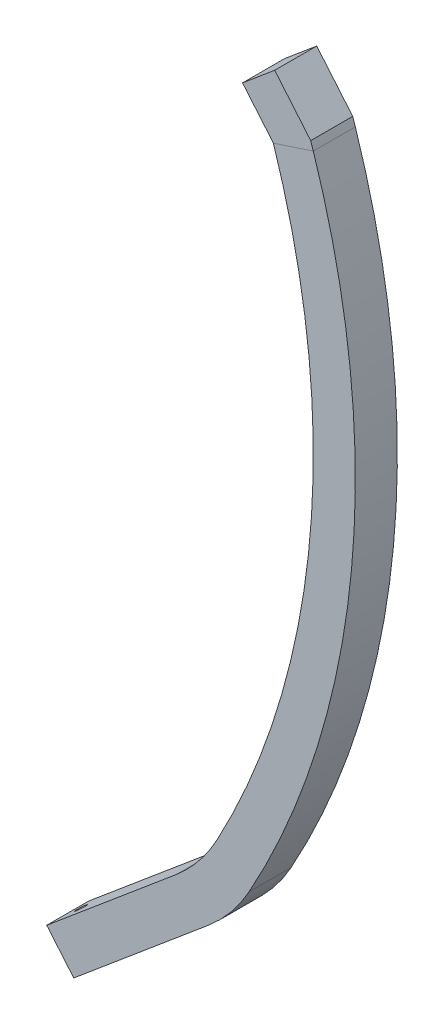
ISO-10303-21;
HEADER;
FILE_DESCRIPTION(('STEP AP214'),'2;1');
FILE_NAME('part.step','',(''),(''),'','','');
FILE_SCHEMA(('AUTOMOTIVE_DESIGN { 1 0 10303 214 1 1 1 1 }'));
ENDSEC;
DATA;
#1=APPLICATION_CONTEXT('core data for automotive mechanical design processes');
#2=APPLICATION_PROTOCOL_DEFINITION('international standard','automotive_design',2000,#1);
#3=PRODUCT_CONTEXT('',#1,'mechanical');
#4=PRODUCT('Part','Part','',(#3));
#5=PRODUCT_RELATED_PRODUCT_CATEGORY('part','',(#4));
#6=PRODUCT_DEFINITION_FORMATION('','',#4);
#7=PRODUCT_DEFINITION_CONTEXT('part definition',#1,'design');
#8=PRODUCT_DEFINITION('design','',#6,#7);
#9=PRODUCT_DEFINITION_SHAPE('','',#8);
#10=(LENGTH_UNIT() NAMED_UNIT(*) SI_UNIT(.MILLI.,.METRE.));
#11=(NAMED_UNIT(*) PLANE_ANGLE_UNIT() SI_UNIT($,.RADIAN.));
#12=(NAMED_UNIT(*) SI_UNIT($,.STERADIAN.) SOLID_ANGLE_UNIT());
#13=UNCERTAINTY_MEASURE_WITH_UNIT(LENGTH_MEASURE(1.E-05),#10,'distance_accuracy_value','');
#14=(GEOMETRIC_REPRESENTATION_CONTEXT(3) GLOBAL_UNCERTAINTY_ASSIGNED_CONTEXT((#13)) GLOBAL_UNIT_ASSIGNED_CONTEXT((#10,
#11,#12)) REPRESENTATION_CONTEXT('',''));
#15=CARTESIAN_POINT('',(0.,0.,0.));
#16=DIRECTION('',(0.,0.,1.));
#17=DIRECTION('',(1.,0.,0.));
#18=AXIS2_PLACEMENT_3D('',#15,#16,#17);
#19=CARTESIAN_POINT('',(15.6848822423879,86.3493613128839,62.996629270052));
#20=DIRECTION('',(-0.311318234282315,0.950305717652662,0.));
#21=DIRECTION('',(-0.950305717652662,-0.311318234282315,0.));
#22=AXIS2_PLACEMENT_3D('',#19,#20,#21);
#23=PLANE('',#22);
#24=DIRECTION('',(0.950305717652662,0.311318234282315,0.));
#25=VECTOR('',#24,1.);
#26=CARTESIAN_POINT('',(15.6848822423879,86.3493613128839,50.9966292700521));
#27=LINE('',#26,#25);
#28=CARTESIAN_POINT('',(15.6848822423879,86.3493613128839,50.9966292700521));
#29=VERTEX_POINT('',#28);
#30=CARTESIAN_POINT('',(27.0885508542199,90.0851801242715,50.9966292700521));
#31=VERTEX_POINT('',#30);
#32=EDGE_CURVE('E118',#29,#31,#27,.T.);
#33=ORIENTED_EDGE('',*,*,#32,.T.);
#34=DIRECTION('',(0.,0.,-1.));
#35=VECTOR('',#34,1.);
#36=CARTESIAN_POINT('',(27.0885508542199,90.0851801242715,62.9966292700521));
#37=LINE('',#36,#35);
#38=CARTESIAN_POINT('',(27.0885508542199,90.0851801242715,62.9966292700521));
#39=VERTEX_POINT('',#38);
#40=EDGE_CURVE('E12',#39,#31,#37,.T.);
#41=ORIENTED_EDGE('',*,*,#40,.F.);
#42=DIRECTION('',(0.950305717652662,0.311318234282315,0.));
#43=VECTOR('',#42,1.);
#44=CARTESIAN_POINT('',(15.6848822423879,86.3493613128839,62.996629270052));
#45=LINE('',#44,#43);
#46=CARTESIAN_POINT('',(15.6848822423879,86.3493613128839,62.996629270052));
#47=VERTEX_POINT('',#46);
#48=EDGE_CURVE('E126',#47,#39,#45,.T.);
#49=ORIENTED_EDGE('',*,*,#48,.F.);
#50=DIRECTION('',(0.,0.,-1.));
#51=VECTOR('',#50,1.);
#52=CARTESIAN_POINT('',(15.6848822423879,86.3493613128839,62.996629270052));
#53=LINE('',#52,#51);
#54=EDGE_CURVE('E114',#47,#29,#53,.T.);
#55=ORIENTED_EDGE('',*,*,#54,.T.);
#56=EDGE_LOOP('',(#33,#41,#49,#55));
#57=FACE_BOUND('',#56,.T.);
#58=ADVANCED_FACE('F44',(#57),#23,.F.);
#59=CARTESIAN_POINT('',(-202.387921552125,14.9091511140061,62.9966292700511));
#60=DIRECTION('',(0.,0.,-1.));
#61=DIRECTION('',(0.,-1.,0.));
#62=AXIS2_PLACEMENT_3D('',#59,#60,#61);
#63=CYLINDRICAL_SURFACE('',#62,241.476472406345);
#64=CARTESIAN_POINT('',(-202.387921552125,14.9091511140062,50.996629270051));
#65=DIRECTION('',(0.,0.,1.));
#66=DIRECTION('',(0.,1.,0.));
#67=AXIS2_PLACEMENT_3D('',#64,#65,#66);
#68=CIRCLE('',#67,241.476472406345);
#69=CARTESIAN_POINT('',(26.3474014816234,92.3109516257451,50.9966292700521));
#70=VERTEX_POINT('',#69);
#71=EDGE_CURVE('E121',#31,#70,#68,.T.);
#72=ORIENTED_EDGE('',*,*,#71,.T.);
#73=DIRECTION('',(0.,0.,-1.));
#74=VECTOR('',#73,1.);
#75=CARTESIAN_POINT('',(26.3474014816233,92.3109516257451,62.9966292700521));
#76=LINE('',#75,#74);
#77=CARTESIAN_POINT('',(26.3474014816233,92.3109516257451,62.9966292700521));
#78=VERTEX_POINT('',#77);
#79=EDGE_CURVE('E52',#78,#70,#76,.T.);
#80=ORIENTED_EDGE('',*,*,#79,.F.);
#81=CARTESIAN_POINT('',(-202.387921552125,14.9091511140061,62.9966292700511));
#82=DIRECTION('',(0.,0.,1.));
#83=DIRECTION('',(0.,1.,0.));
#84=AXIS2_PLACEMENT_3D('',#81,#82,#83);
#85=CIRCLE('',#84,241.476472406345);
#86=EDGE_CURVE('E94',#39,#78,#85,.T.);
#87=ORIENTED_EDGE('',*,*,#86,.F.);
#88=ORIENTED_EDGE('',*,*,#40,.T.);
#89=EDGE_LOOP('',(#72,#80,#87,#88));
#90=FACE_BOUND('',#89,.T.);
#91=ADVANCED_FACE('F145',(#90),#63,.T.);
#92=CARTESIAN_POINT('',(16.0627997266388,104.567662715649,62.9966292700521));
#93=DIRECTION('',(-0.766044443118982,-0.642787609686534,0.));
#94=DIRECTION('',(0.642787609686534,-0.766044443118982,0.));
#95=AXIS2_PLACEMENT_3D('',#92,#93,#94);
#96=PLANE('',#95);
#97=DIRECTION('',(-0.642787609686534,0.766044443118982,0.));
#98=VECTOR('',#97,1.);
#99=CARTESIAN_POINT('',(16.0627997266388,104.567662715649,50.9966292700521));
#100=LINE('',#99,#98);
#101=CARTESIAN_POINT('',(16.0627997266388,104.567662715649,50.9966292700521));
#102=VERTEX_POINT('',#101);
#103=EDGE_CURVE('E109',#70,#102,#100,.T.);
#104=ORIENTED_EDGE('',*,*,#103,.T.);
#105=DIRECTION('',(0.,0.,-1.));
#106=VECTOR('',#105,1.);
#107=CARTESIAN_POINT('',(16.0627997266388,104.567662715649,62.9966292700521));
#108=LINE('',#107,#106);
#109=CARTESIAN_POINT('',(16.0627997266388,104.567662715649,62.9966292700521));
#110=VERTEX_POINT('',#109);
#111=EDGE_CURVE('E106',#110,#102,#108,.T.);
#112=ORIENTED_EDGE('',*,*,#111,.F.);
#113=DIRECTION('',(-0.642787609686534,0.766044443118982,0.));
#114=VECTOR('',#113,1.);
#115=CARTESIAN_POINT('',(16.0627997266388,104.567662715649,62.9966292700521));
#116=LINE('',#115,#114);
#117=EDGE_CURVE('E98',#78,#110,#116,.T.);
#118=ORIENTED_EDGE('',*,*,#117,.F.);
#119=ORIENTED_EDGE('',*,*,#79,.T.);
#120=EDGE_LOOP('',(#104,#112,#118,#119));
#121=FACE_BOUND('',#120,.T.);
#122=ADVANCED_FACE('F107',(#121),#96,.F.);
#123=CARTESIAN_POINT('',(6.87026640921099,96.8542113994104,62.9966292700521));
#124=DIRECTION('',(0.642787609686535,-0.766044443118981,0.));
#125=DIRECTION('',(0.766044443118981,0.642787609686535,0.));
#126=AXIS2_PLACEMENT_3D('',#123,#124,#125);
#127=PLANE('',#126);
#128=DIRECTION('',(-0.766044443118981,-0.642787609686535,0.));
#129=VECTOR('',#128,1.);
#130=CARTESIAN_POINT('',(6.87026640921103,96.8542113994104,50.9966292700521));
#131=LINE('',#130,#129);
#132=CARTESIAN_POINT('',(6.87026640921103,96.8542113994104,50.9966292700521));
#133=VERTEX_POINT('',#132);
#134=EDGE_CURVE('E80',#102,#133,#131,.T.);
#135=ORIENTED_EDGE('',*,*,#134,.T.);
#136=DIRECTION('',(0.,0.,-1.));
#137=VECTOR('',#136,1.);
#138=CARTESIAN_POINT('',(6.87026640921099,96.8542113994104,62.9966292700521));
#139=LINE('',#138,#137);
#140=CARTESIAN_POINT('',(6.87026640921099,96.8542113994104,62.9966292700521));
#141=VERTEX_POINT('',#140);
#142=EDGE_CURVE('E110',#141,#133,#139,.T.);
#143=ORIENTED_EDGE('',*,*,#142,.F.);
#144=DIRECTION('',(-0.766044443118981,-0.642787609686535,0.));
#145=VECTOR('',#144,1.);
#146=CARTESIAN_POINT('',(6.87026640921099,96.8542113994104,62.9966292700521));
#147=LINE('',#146,#145);
#148=EDGE_CURVE('E102',#110,#141,#147,.T.);
#149=ORIENTED_EDGE('',*,*,#148,.F.);
#150=ORIENTED_EDGE('',*,*,#111,.T.);
#151=EDGE_LOOP('',(#135,#143,#149,#150));
#152=FACE_BOUND('',#151,.T.);
#153=ADVANCED_FACE('F112',(#152),#127,.F.);
#154=CARTESIAN_POINT('',(15.6848822423879,86.3493613128839,62.996629270052));
#155=DIRECTION('',(0.766044443118981,0.642787609686535,0.));
#156=DIRECTION('',(-0.642787609686535,0.766044443118982,0.));
#157=AXIS2_PLACEMENT_3D('',#154,#155,#156);
#158=PLANE('',#157);
#159=DIRECTION('',(0.642787609686535,-0.766044443118982,0.));
#160=VECTOR('',#159,1.);
#161=CARTESIAN_POINT('',(15.6848822423879,86.3493613128839,50.9966292700521));
#162=LINE('',#161,#160);
#163=EDGE_CURVE('E86',#133,#29,#162,.T.);
#164=ORIENTED_EDGE('',*,*,#163,.T.);
#165=ORIENTED_EDGE('',*,*,#54,.F.);
#166=DIRECTION('',(0.642787609686535,-0.766044443118982,0.));
#167=VECTOR('',#166,1.);
#168=CARTESIAN_POINT('',(15.6848822423879,86.3493613128839,62.996629270052));
#169=LINE('',#168,#167);
#170=EDGE_CURVE('E60',#141,#47,#169,.T.);
#171=ORIENTED_EDGE('',*,*,#170,.F.);
#172=ORIENTED_EDGE('',*,*,#142,.T.);
#173=EDGE_LOOP('',(#164,#165,#171,#172));
#174=FACE_BOUND('',#173,.T.);
#175=ADVANCED_FACE('F134',(#174),#158,.F.);
#176=CARTESIAN_POINT('',(-202.387921552125,14.9091511140061,62.9966292700511));
#177=DIRECTION('',(0.,0.,1.));
#178=DIRECTION('',(0.,1.,0.));
#179=AXIS2_PLACEMENT_3D('',#176,#177,#178);
#180=PLANE('',#179);
#181=ORIENTED_EDGE('',*,*,#48,.T.);
#182=ORIENTED_EDGE('',*,*,#86,.T.);
#183=ORIENTED_EDGE('',*,*,#117,.T.);
#184=ORIENTED_EDGE('',*,*,#148,.T.);
#185=ORIENTED_EDGE('',*,*,#170,.T.);
#186=EDGE_LOOP('',(#181,#182,#183,#184,#185));
#187=FACE_BOUND('',#186,.T.);
#188=ADVANCED_FACE('F100',(#187),#180,.T.);
#189=CARTESIAN_POINT('',(-202.387921552125,14.9091511140062,50.996629270051));
#190=DIRECTION('',(0.,0.,1.));
#191=DIRECTION('',(0.,1.,0.));
#192=AXIS2_PLACEMENT_3D('',#189,#190,#191);
#193=PLANE('',#192);
#194=ORIENTED_EDGE('',*,*,#32,.F.);
#195=ORIENTED_EDGE('',*,*,#163,.F.);
#196=ORIENTED_EDGE('',*,*,#134,.F.);
#197=ORIENTED_EDGE('',*,*,#103,.F.);
#198=ORIENTED_EDGE('',*,*,#71,.F.);
#199=EDGE_LOOP('',(#194,#195,#196,#197,#198));
#200=FACE_BOUND('',#199,.T.);
#201=ADVANCED_FACE('F130',(#200),#193,.F.);
#202=CLOSED_SHELL('',(#58,#91,#122,#153,#175,#188,#201));
#203=MANIFOLD_SOLID_BREP('B2',#202);
#204=CARTESIAN_POINT('',(-202.387921552125,14.9091511140061,62.9966292700511));
#205=DIRECTION('',(0.,0.,-1.));
#206=DIRECTION('',(0.,-1.,0.));
#207=AXIS2_PLACEMENT_3D('',#204,#205,#206);
#208=CYLINDRICAL_SURFACE('',#207,241.476472406345);
#209=CARTESIAN_POINT('',(-202.387921552125,14.9091511140061,62.9966292700511));
#210=DIRECTION('',(0.,0.,1.));
#211=DIRECTION('',(0.,-1.,0.));
#212=AXIS2_PLACEMENT_3D('',#209,#210,#211);
#213=CIRCLE('',#212,241.476472406345);
#214=CARTESIAN_POINT('',(8.71494124510214,-102.33618160601,62.9966292700514));
#215=VERTEX_POINT('',#214);
#216=CARTESIAN_POINT('',(27.0885508542198,90.0851801242717,62.9966292700521));
#217=VERTEX_POINT('',#216);
#218=EDGE_CURVE('E288',#215,#217,#213,.T.);
#219=ORIENTED_EDGE('',*,*,#218,.F.);
#220=DIRECTION('',(0.,0.,-1.));
#221=VECTOR('',#220,1.);
#222=CARTESIAN_POINT('',(8.71494124510214,-102.33618160601,62.9966292700514));
#223=LINE('',#222,#221);
#224=CARTESIAN_POINT('',(8.71494124510218,-102.33618160601,50.9966292700514));
#225=VERTEX_POINT('',#224);
#226=EDGE_CURVE('E309',#215,#225,#223,.T.);
#227=ORIENTED_EDGE('',*,*,#226,.T.);
#228=CARTESIAN_POINT('',(-202.387921552125,14.9091511140062,50.996629270051));
#229=DIRECTION('',(0.,0.,1.));
#230=DIRECTION('',(0.,-1.,0.));
#231=AXIS2_PLACEMENT_3D('',#228,#229,#230);
#232=CIRCLE('',#231,241.476472406345);
#233=CARTESIAN_POINT('',(27.0885508542199,90.0851801242717,50.9966292700521));
#234=VERTEX_POINT('',#233);
#235=EDGE_CURVE('E287',#225,#234,#232,.T.);
#236=ORIENTED_EDGE('',*,*,#235,.T.);
#237=DIRECTION('',(0.,0.,-1.));
#238=VECTOR('',#237,1.);
#239=CARTESIAN_POINT('',(27.0885508542198,90.0851801242717,62.9966292700521));
#240=LINE('',#239,#238);
#241=EDGE_CURVE('E303',#217,#234,#240,.T.);
#242=ORIENTED_EDGE('',*,*,#241,.F.);
#243=EDGE_LOOP('',(#219,#227,#236,#242));
#244=FACE_BOUND('',#243,.T.);
#245=ADVANCED_FACE('F193',(#244),#208,.T.);
#246=CARTESIAN_POINT('',(27.0885508542198,90.0851801242717,62.9966292700521));
#247=DIRECTION('',(0.311318234282315,-0.950305717652662,0.));
#248=DIRECTION('',(0.950305717652662,0.311318234282315,0.));
#249=AXIS2_PLACEMENT_3D('',#246,#247,#248);
#250=PLANE('',#249);
#251=DIRECTION('',(-0.950305717652662,-0.311318234282315,0.));
#252=VECTOR('',#251,1.);
#253=CARTESIAN_POINT('',(27.0885508542199,90.0851801242717,50.9966292700521));
#254=LINE('',#253,#252);
#255=CARTESIAN_POINT('',(15.6848822423879,86.3493613128839,50.9966292700521));
#256=VERTEX_POINT('',#255);
#257=EDGE_CURVE('E297',#234,#256,#254,.T.);
#258=ORIENTED_EDGE('',*,*,#257,.T.);
#259=DIRECTION('',(0.,0.,-1.));
#260=VECTOR('',#259,1.);
#261=CARTESIAN_POINT('',(15.6848822423879,86.3493613128839,62.996629270052));
#262=LINE('',#261,#260);
#263=CARTESIAN_POINT('',(15.6848822423879,86.3493613128839,62.996629270052));
#264=VERTEX_POINT('',#263);
#265=EDGE_CURVE('E295',#264,#256,#262,.T.);
#266=ORIENTED_EDGE('',*,*,#265,.F.);
#267=DIRECTION('',(-0.950305717652662,-0.311318234282315,0.));
#268=VECTOR('',#267,1.);
#269=CARTESIAN_POINT('',(27.0885508542198,90.0851801242717,62.9966292700521));
#270=LINE('',#269,#268);
#271=EDGE_CURVE('E290',#217,#264,#270,.T.);
#272=ORIENTED_EDGE('',*,*,#271,.F.);
#273=ORIENTED_EDGE('',*,*,#241,.T.);
#274=EDGE_LOOP('',(#258,#266,#272,#273));
#275=FACE_BOUND('',#274,.T.);
#276=ADVANCED_FACE('F335',(#275),#250,.F.);
#277=CARTESIAN_POINT('',(-202.387921552125,14.9091511140061,62.9966292700511));
#278=DIRECTION('',(0.,0.,-1.));
#279=DIRECTION('',(0.,-1.,0.));
#280=AXIS2_PLACEMENT_3D('',#277,#278,#279);
#281=CYLINDRICAL_SURFACE('',#280,229.476472406345);
#282=CARTESIAN_POINT('',(-202.387921552125,14.9091511140062,50.996629270051));
#283=DIRECTION('',(0.,0.,-1.));
#284=DIRECTION('',(0.,-1.,0.));
#285=AXIS2_PLACEMENT_3D('',#282,#283,#284);
#286=CIRCLE('',#285,229.476472406345);
#287=CARTESIAN_POINT('',(-0.43456520138184,-94.0600796198562,50.9966292700514));
#288=VERTEX_POINT('',#287);
#289=EDGE_CURVE('E291',#256,#288,#286,.T.);
#290=ORIENTED_EDGE('',*,*,#289,.T.);
#291=DIRECTION('',(0.,0.,-1.));
#292=VECTOR('',#291,1.);
#293=CARTESIAN_POINT('',(-0.434565201381826,-94.0600796198563,62.9966292700514));
#294=LINE('',#293,#292);
#295=CARTESIAN_POINT('',(-0.434565201381881,-94.0600796198563,62.9966292700514));
#296=VERTEX_POINT('',#295);
#297=EDGE_CURVE('E318',#288,#296,#294,.F.);
#298=ORIENTED_EDGE('',*,*,#297,.T.);
#299=CARTESIAN_POINT('',(-202.387921552125,14.9091511140061,62.9966292700511));
#300=DIRECTION('',(0.,0.,-1.));
#301=DIRECTION('',(0.,-1.,0.));
#302=AXIS2_PLACEMENT_3D('',#299,#300,#301);
#303=CIRCLE('',#302,229.476472406345);
#304=EDGE_CURVE('E293',#264,#296,#303,.T.);
#305=ORIENTED_EDGE('',*,*,#304,.F.);
#306=ORIENTED_EDGE('',*,*,#265,.T.);
#307=EDGE_LOOP('',(#290,#298,#305,#306));
#308=FACE_BOUND('',#307,.T.);
#309=ADVANCED_FACE('F329',(#308),#281,.F.);
#310=CARTESIAN_POINT('',(-202.387921552125,14.9091511140061,62.9966292700511));
#311=DIRECTION('',(0.,0.,-1.));
#312=DIRECTION('',(0.,-1.,0.));
#313=AXIS2_PLACEMENT_3D('',#310,#311,#312);
#314=PLANE('',#313);
#315=DIRECTION('',(-0.766044443118982,-0.642787609686535,0.));
#316=VECTOR('',#315,1.);
#317=CARTESIAN_POINT('',(-32.9074279271036,-141.577337029373,62.9966292700511));
#318=LINE('',#317,#316);
#319=CARTESIAN_POINT('',(-2.85653355464067,-116.361642644892,62.9966292700513));
#320=VERTEX_POINT('',#319);
#321=CARTESIAN_POINT('',(-41.3339168014124,-148.648000735925,62.996629270051));
#322=VERTEX_POINT('',#321);
#323=EDGE_CURVE('E263',#320,#322,#318,.T.);
#324=ORIENTED_EDGE('',*,*,#323,.F.);
#325=CARTESIAN_POINT('',(-34.9959140389674,-78.0594204889433,62.9966292700513));
#326=DIRECTION('',(0.,0.,-1.));
#327=DIRECTION('',(0.,-1.,0.));
#328=AXIS2_PLACEMENT_3D('',#325,#326,#327);
#329=CIRCLE('',#328,50.);
#330=EDGE_CURVE('E316',#320,#215,#329,.F.);
#331=ORIENTED_EDGE('',*,*,#330,.T.);
#332=ORIENTED_EDGE('',*,*,#218,.T.);
#333=ORIENTED_EDGE('',*,*,#271,.T.);
#334=ORIENTED_EDGE('',*,*,#304,.T.);
#335=CARTESIAN_POINT('',(-44.4376288342267,-70.3170724193392,62.9966292700513));
#336=DIRECTION('',(0.,0.,-1.));
#337=DIRECTION('',(0.,-1.,0.));
#338=AXIS2_PLACEMENT_3D('',#335,#336,#337);
#339=CIRCLE('',#338,50.);
#340=CARTESIAN_POINT('',(-12.2982483499,-108.619294575288,62.9966292700513));
#341=VERTEX_POINT('',#340);
#342=EDGE_CURVE('E202',#296,#341,#339,.T.);
#343=ORIENTED_EDGE('',*,*,#342,.T.);
#344=DIRECTION('',(-0.766044443118982,-0.642787609686534,0.));
#345=VECTOR('',#344,1.);
#346=CARTESIAN_POINT('',(-40.620879243342,-132.384803711945,62.9966292700511));
#347=LINE('',#346,#345);
#348=CARTESIAN_POINT('',(-49.0473681176508,-139.455467418497,62.996629270051));
#349=VERTEX_POINT('',#348);
#350=EDGE_CURVE('E255',#341,#349,#347,.T.);
#351=ORIENTED_EDGE('',*,*,#350,.T.);
#352=DIRECTION('',(-0.642787609686532,0.766044443118984,0.));
#353=VECTOR('',#352,1.);
#354=CARTESIAN_POINT('',(-41.3339168014124,-148.648000735925,62.996629270051));
#355=LINE('',#354,#353);
#356=EDGE_CURVE('E260',#322,#349,#355,.T.);
#357=ORIENTED_EDGE('',*,*,#356,.F.);
#358=EDGE_LOOP('',(#324,#331,#332,#333,#334,#343,#351,#357));
#359=FACE_BOUND('',#358,.T.);
#360=ADVANCED_FACE('F258',(#359),#314,.F.);
#361=CARTESIAN_POINT('',(-202.387921552125,14.9091511140062,50.996629270051));
#362=DIRECTION('',(0.,0.,-1.));
#363=DIRECTION('',(0.,-1.,0.));
#364=AXIS2_PLACEMENT_3D('',#361,#362,#363);
#365=PLANE('',#364);
#366=ORIENTED_EDGE('',*,*,#235,.F.);
#367=CARTESIAN_POINT('',(-34.9959140389674,-78.0594204889432,50.9966292700513));
#368=DIRECTION('',(0.,0.,-1.));
#369=DIRECTION('',(0.,-1.,0.));
#370=AXIS2_PLACEMENT_3D('',#367,#368,#369);
#371=CIRCLE('',#370,50.);
#372=CARTESIAN_POINT('',(-2.85653355464065,-116.361642644892,50.9966292700513));
#373=VERTEX_POINT('',#372);
#374=EDGE_CURVE('E312',#225,#373,#371,.T.);
#375=ORIENTED_EDGE('',*,*,#374,.T.);
#376=DIRECTION('',(0.766044443118982,0.642787609686535,0.));
#377=VECTOR('',#376,1.);
#378=CARTESIAN_POINT('',(-55.3081107910275,-160.373741758611,50.9966292700509));
#379=LINE('',#378,#377);
#380=CARTESIAN_POINT('',(-41.3339168014124,-148.648000735925,50.996629270051));
#381=VERTEX_POINT('',#380);
#382=EDGE_CURVE('E306',#381,#373,#379,.T.);
#383=ORIENTED_EDGE('',*,*,#382,.F.);
#384=DIRECTION('',(0.642787609686532,-0.766044443118984,0.));
#385=VECTOR('',#384,1.);
#386=CARTESIAN_POINT('',(-41.3339168014124,-148.648000735925,50.996629270051));
#387=LINE('',#386,#385);
#388=CARTESIAN_POINT('',(-49.0473681176508,-139.455467418497,50.996629270051));
#389=VERTEX_POINT('',#388);
#390=EDGE_CURVE('E272',#389,#381,#387,.T.);
#391=ORIENTED_EDGE('',*,*,#390,.F.);
#392=DIRECTION('',(-0.766044443118982,-0.642787609686534,0.));
#393=VECTOR('',#392,1.);
#394=CARTESIAN_POINT('',(-40.6208792433419,-132.384803711945,50.9966292700511));
#395=LINE('',#394,#393);
#396=CARTESIAN_POINT('',(-12.2982483499,-108.619294575288,50.9966292700513));
#397=VERTEX_POINT('',#396);
#398=EDGE_CURVE('E262',#397,#389,#395,.T.);
#399=ORIENTED_EDGE('',*,*,#398,.F.);
#400=CARTESIAN_POINT('',(-44.4376288342267,-70.3170724193391,50.9966292700513));
#401=DIRECTION('',(0.,0.,-1.));
#402=DIRECTION('',(0.,-1.,0.));
#403=AXIS2_PLACEMENT_3D('',#400,#401,#402);
#404=CIRCLE('',#403,50.);
#405=EDGE_CURVE('E42',#397,#288,#404,.F.);
#406=ORIENTED_EDGE('',*,*,#405,.T.);
#407=ORIENTED_EDGE('',*,*,#289,.F.);
#408=ORIENTED_EDGE('',*,*,#257,.F.);
#409=EDGE_LOOP('',(#366,#375,#383,#391,#399,#406,#407,#408));
#410=FACE_BOUND('',#409,.T.);
#411=ADVANCED_FACE('F325',(#410),#365,.T.);
#412=CARTESIAN_POINT('',(-40.6208792433418,-132.384803711945,-1.31588355744146));
#413=DIRECTION('',(-0.642787609686534,0.766044443118982,0.));
#414=DIRECTION('',(-0.766044443118982,-0.642787609686534,0.));
#415=AXIS2_PLACEMENT_3D('',#412,#413,#414);
#416=PLANE('',#415);
#417=CARTESIAN_POINT('',(-45.2171459020559,-136.241529370064,56.9966292700511));
#418=DIRECTION('',(-0.642787609686533,0.766044443118984,0.));
#419=DIRECTION('',(-0.766044443118984,-0.642787609686533,0.));
#420=AXIS2_PLACEMENT_3D('',#417,#418,#419);
#421=CIRCLE('',#420,1.55000000000001);
#422=CARTESIAN_POINT('',(-46.4045147888904,-137.237850165078,56.9966292700511));
#423=VERTEX_POINT('',#422);
#424=EDGE_CURVE('E280',#423,#423,#421,.T.);
#425=ORIENTED_EDGE('',*,*,#424,.F.);
#426=EDGE_LOOP('',(#425));
#427=FACE_BOUND('',#426,.T.);
#428=ORIENTED_EDGE('',*,*,#350,.F.);
#429=DIRECTION('',(0.,0.,-1.));
#430=VECTOR('',#429,1.);
#431=CARTESIAN_POINT('',(-12.2982483498998,-108.619294575288,-1.31588355744128));
#432=LINE('',#431,#430);
#433=EDGE_CURVE('E320',#341,#397,#432,.T.);
#434=ORIENTED_EDGE('',*,*,#433,.T.);
#435=ORIENTED_EDGE('',*,*,#398,.T.);
#436=DIRECTION('',(0.,0.,-1.));
#437=VECTOR('',#436,1.);
#438=CARTESIAN_POINT('',(-49.0473681176508,-139.455467418497,50.996629270051));
#439=LINE('',#438,#437);
#440=EDGE_CURVE('E266',#349,#389,#439,.T.);
#441=ORIENTED_EDGE('',*,*,#440,.F.);
#442=EDGE_LOOP('',(#428,#434,#435,#441));
#443=FACE_BOUND('',#442,.T.);
#444=ADVANCED_FACE('F267',(#427,#443),#416,.T.);
#445=CARTESIAN_POINT('',(-32.9074279271035,-141.577337029373,50.9966292700511));
#446=DIRECTION('',(-0.642787609686535,0.766044443118982,0.));
#447=DIRECTION('',(-0.766044443118982,-0.642787609686535,0.));
#448=AXIS2_PLACEMENT_3D('',#445,#446,#447);
#449=PLANE('',#448);
#450=CARTESIAN_POINT('',(-37.5036945858173,-145.434062687492,56.9966292700511));
#451=DIRECTION('',(-0.642787609686535,0.766044443118982,0.));
#452=DIRECTION('',(-0.766044443118982,-0.642787609686535,0.));
#453=AXIS2_PLACEMENT_3D('',#450,#451,#452);
#454=CIRCLE('',#453,1.55000000000001);
#455=CARTESIAN_POINT('',(-38.6910634726518,-146.430383482506,56.9966292700511));
#456=VERTEX_POINT('',#455);
#457=EDGE_CURVE('E197',#456,#456,#454,.T.);
#458=ORIENTED_EDGE('',*,*,#457,.T.);
#459=EDGE_LOOP('',(#458));
#460=FACE_BOUND('',#459,.T.);
#461=ORIENTED_EDGE('',*,*,#382,.T.);
#462=DIRECTION('',(0.,0.,-1.));
#463=VECTOR('',#462,1.);
#464=CARTESIAN_POINT('',(-2.85653355464063,-116.361642644892,50.9966292700513));
#465=LINE('',#464,#463);
#466=EDGE_CURVE('E314',#373,#320,#465,.F.);
#467=ORIENTED_EDGE('',*,*,#466,.T.);
#468=ORIENTED_EDGE('',*,*,#323,.T.);
#469=DIRECTION('',(0.,0.,1.));
#470=VECTOR('',#469,1.);
#471=CARTESIAN_POINT('',(-41.3339168014124,-148.648000735925,50.996629270051));
#472=LINE('',#471,#470);
#473=EDGE_CURVE('E277',#381,#322,#472,.T.);
#474=ORIENTED_EDGE('',*,*,#473,.F.);
#475=EDGE_LOOP('',(#461,#467,#468,#474));
#476=FACE_BOUND('',#475,.T.);
#477=ADVANCED_FACE('F344',(#460,#476),#449,.F.);
#478=CARTESIAN_POINT('',(-34.9959140389674,-78.0594204889433,62.9966292700513));
#479=DIRECTION('',(0.,0.,-1.));
#480=DIRECTION('',(0.,-1.,0.));
#481=AXIS2_PLACEMENT_3D('',#478,#479,#480);
#482=CYLINDRICAL_SURFACE('',#481,50.);
#483=ORIENTED_EDGE('',*,*,#330,.F.);
#484=ORIENTED_EDGE('',*,*,#466,.F.);
#485=ORIENTED_EDGE('',*,*,#374,.F.);
#486=ORIENTED_EDGE('',*,*,#226,.F.);
#487=EDGE_LOOP('',(#483,#484,#485,#486));
#488=FACE_BOUND('',#487,.T.);
#489=ADVANCED_FACE('F341',(#488),#482,.T.);
#490=CARTESIAN_POINT('',(-44.4376288342267,-70.3170724193392,62.9966292700513));
#491=DIRECTION('',(0.,0.,-1.));
#492=DIRECTION('',(0.,-1.,0.));
#493=AXIS2_PLACEMENT_3D('',#490,#491,#492);
#494=CYLINDRICAL_SURFACE('',#493,50.);
#495=ORIENTED_EDGE('',*,*,#405,.F.);
#496=ORIENTED_EDGE('',*,*,#433,.F.);
#497=ORIENTED_EDGE('',*,*,#342,.F.);
#498=ORIENTED_EDGE('',*,*,#297,.F.);
#499=EDGE_LOOP('',(#495,#496,#497,#498));
#500=FACE_BOUND('',#499,.T.);
#501=ADVANCED_FACE('F195',(#500),#494,.F.);
#502=CARTESIAN_POINT('',(-125.658434155729,-48.1539542351431,50.9966292700511));
#503=DIRECTION('',(0.766044443118984,0.642787609686532,0.));
#504=DIRECTION('',(-0.642787609686532,0.766044443118984,0.));
#505=AXIS2_PLACEMENT_3D('',#502,#503,#504);
#506=PLANE('',#505);
#507=ORIENTED_EDGE('',*,*,#356,.T.);
#508=ORIENTED_EDGE('',*,*,#440,.T.);
#509=ORIENTED_EDGE('',*,*,#390,.T.);
#510=ORIENTED_EDGE('',*,*,#473,.T.);
#511=EDGE_LOOP('',(#507,#508,#509,#510));
#512=FACE_BOUND('',#511,.T.);
#513=ADVANCED_FACE('F275',(#512),#506,.F.);
#514=CARTESIAN_POINT('',(-4.27506823394094,-185.034397519312,56.996629270051));
#515=DIRECTION('',(-0.642787609686533,0.766044443118984,0.));
#516=DIRECTION('',(-0.766044443118984,-0.642787609686533,0.));
#517=AXIS2_PLACEMENT_3D('',#514,#515,#516);
#518=CYLINDRICAL_SURFACE('',#517,1.55000000000001);
#519=ORIENTED_EDGE('',*,*,#424,.T.);
#520=EDGE_LOOP('',(#519));
#521=FACE_BOUND('',#520,.T.);
#522=ORIENTED_EDGE('',*,*,#457,.F.);
#523=EDGE_LOOP('',(#522));
#524=FACE_BOUND('',#523,.T.);
#525=ADVANCED_FACE('F410',(#521,#524),#518,.F.);
#526=CLOSED_SHELL('',(#245,#276,#309,#360,#411,#444,#477,#489,#501,#513,#525));
#527=MANIFOLD_SOLID_BREP('B6',#526);
#528=ADVANCED_BREP_SHAPE_REPRESENTATION('',(#18,#203,#527),#14);
#529=SHAPE_DEFINITION_REPRESENTATION(#9,#528);
ENDSEC;
END-ISO-10303-21;
